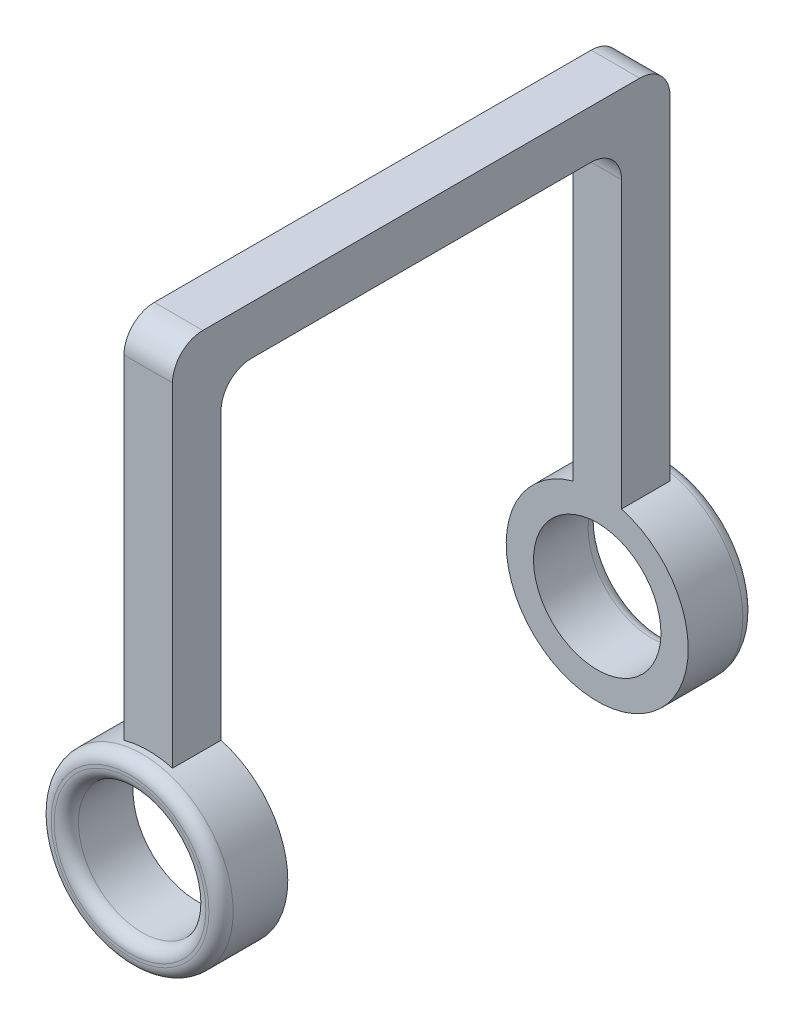
ISO-10303-21;
HEADER;
FILE_DESCRIPTION(('STEP AP214'),'2;1');
FILE_NAME('part.step','',(''),(''),'','','');
FILE_SCHEMA(('AUTOMOTIVE_DESIGN { 1 0 10303 214 1 1 1 1 }'));
ENDSEC;
DATA;
#1=APPLICATION_CONTEXT('core data for automotive mechanical design processes');
#2=APPLICATION_PROTOCOL_DEFINITION('international standard','automotive_design',2000,#1);
#3=PRODUCT_CONTEXT('',#1,'mechanical');
#4=PRODUCT('Part','Part','',(#3));
#5=PRODUCT_RELATED_PRODUCT_CATEGORY('part','',(#4));
#6=PRODUCT_DEFINITION_FORMATION('','',#4);
#7=PRODUCT_DEFINITION_CONTEXT('part definition',#1,'design');
#8=PRODUCT_DEFINITION('design','',#6,#7);
#9=PRODUCT_DEFINITION_SHAPE('','',#8);
#10=(LENGTH_UNIT() NAMED_UNIT(*) SI_UNIT(.MILLI.,.METRE.));
#11=(NAMED_UNIT(*) PLANE_ANGLE_UNIT() SI_UNIT($,.RADIAN.));
#12=(NAMED_UNIT(*) SI_UNIT($,.STERADIAN.) SOLID_ANGLE_UNIT());
#13=UNCERTAINTY_MEASURE_WITH_UNIT(LENGTH_MEASURE(1.E-05),#10,'distance_accuracy_value','');
#14=(GEOMETRIC_REPRESENTATION_CONTEXT(3) GLOBAL_UNCERTAINTY_ASSIGNED_CONTEXT((#13)) GLOBAL_UNIT_ASSIGNED_CONTEXT((#10,
#11,#12)) REPRESENTATION_CONTEXT('',''));
#15=CARTESIAN_POINT('',(0.,0.,0.));
#16=DIRECTION('',(0.,0.,1.));
#17=DIRECTION('',(1.,0.,0.));
#18=AXIS2_PLACEMENT_3D('',#15,#16,#17);
#19=CARTESIAN_POINT('',(0.,0.,-82.));
#20=DIRECTION('',(0.,0.,1.));
#21=DIRECTION('',(1.,0.,0.));
#22=AXIS2_PLACEMENT_3D('',#19,#20,#21);
#23=CYLINDRICAL_SURFACE('',#22,15.);
#24=CARTESIAN_POINT('',(0.,0.,1.));
#25=DIRECTION('',(0.,0.,1.));
#26=DIRECTION('',(1.,0.,0.));
#27=AXIS2_PLACEMENT_3D('',#24,#25,#26);
#28=CIRCLE('',#27,15.);
#29=CARTESIAN_POINT('',(15.,0.,1.));
#30=VERTEX_POINT('',#29);
#31=EDGE_CURVE('E240',#30,#30,#28,.F.);
#32=ORIENTED_EDGE('',*,*,#31,.T.);
#33=EDGE_LOOP('',(#32));
#34=FACE_BOUND('',#33,.T.);
#35=CARTESIAN_POINT('',(0.,0.,-8.00000000000001));
#36=DIRECTION('',(0.,0.,1.));
#37=DIRECTION('',(1.,0.,0.));
#38=AXIS2_PLACEMENT_3D('',#35,#36,#37);
#39=CIRCLE('',#38,15.);
#40=CARTESIAN_POINT('',(4.00000000000001,14.456832294801,-8.00000000000001));
#41=VERTEX_POINT('',#40);
#42=CARTESIAN_POINT('',(-4.,14.456832294801,-8.00000000000001));
#43=VERTEX_POINT('',#42);
#44=EDGE_CURVE('E291',#41,#43,#39,.F.);
#45=ORIENTED_EDGE('',*,*,#44,.F.);
#46=DIRECTION('',(0.,0.,1.));
#47=VECTOR('',#46,1.);
#48=CARTESIAN_POINT('',(4.00000000000001,14.456832294801,-82.));
#49=LINE('',#48,#47);
#50=CARTESIAN_POINT('',(4.00000000000001,14.456832294801,0.));
#51=VERTEX_POINT('',#50);
#52=EDGE_CURVE('E169',#41,#51,#49,.T.);
#53=ORIENTED_EDGE('',*,*,#52,.T.);
#54=CARTESIAN_POINT('',(0.,0.,0.));
#55=DIRECTION('',(0.,0.,1.));
#56=DIRECTION('',(1.,0.,0.));
#57=AXIS2_PLACEMENT_3D('',#54,#55,#56);
#58=CIRCLE('',#57,15.);
#59=CARTESIAN_POINT('',(-3.99999999999999,14.456832294801,0.));
#60=VERTEX_POINT('',#59);
#61=EDGE_CURVE('E308',#51,#60,#58,.T.);
#62=ORIENTED_EDGE('',*,*,#61,.T.);
#63=DIRECTION('',(0.,0.,1.));
#64=VECTOR('',#63,1.);
#65=CARTESIAN_POINT('',(-3.99999999999999,14.456832294801,-82.));
#66=LINE('',#65,#64);
#67=EDGE_CURVE('E295',#43,#60,#66,.T.);
#68=ORIENTED_EDGE('',*,*,#67,.F.);
#69=EDGE_LOOP('',(#45,#53,#62,#68));
#70=FACE_BOUND('',#69,.T.);
#71=ADVANCED_FACE('F41',(#34,#70),#23,.T.);
#72=CARTESIAN_POINT('',(0.,0.,-82.));
#73=DIRECTION('',(0.,0.,1.));
#74=DIRECTION('',(1.,0.,0.));
#75=AXIS2_PLACEMENT_3D('',#72,#73,#74);
#76=CYLINDRICAL_SURFACE('',#75,10.5);
#77=CARTESIAN_POINT('',(0.,0.,1.));
#78=DIRECTION('',(0.,0.,1.));
#79=DIRECTION('',(1.,0.,0.));
#80=AXIS2_PLACEMENT_3D('',#77,#78,#79);
#81=CIRCLE('',#80,10.5);
#82=CARTESIAN_POINT('',(10.5,0.,1.));
#83=VERTEX_POINT('',#82);
#84=EDGE_CURVE('E244',#83,#83,#81,.T.);
#85=ORIENTED_EDGE('',*,*,#84,.T.);
#86=EDGE_LOOP('',(#85));
#87=FACE_BOUND('',#86,.T.);
#88=CARTESIAN_POINT('',(0.,0.,-8.00000000000001));
#89=DIRECTION('',(0.,0.,1.));
#90=DIRECTION('',(1.,0.,0.));
#91=AXIS2_PLACEMENT_3D('',#88,#89,#90);
#92=CIRCLE('',#91,10.5);
#93=CARTESIAN_POINT('',(10.5,0.,-8.00000000000001));
#94=VERTEX_POINT('',#93);
#95=EDGE_CURVE('E314',#94,#94,#92,.F.);
#96=ORIENTED_EDGE('',*,*,#95,.T.);
#97=EDGE_LOOP('',(#96));
#98=FACE_BOUND('',#97,.T.);
#99=ADVANCED_FACE('F270',(#87,#98),#76,.F.);
#100=CARTESIAN_POINT('',(0.,0.,-83.));
#101=DIRECTION('',(0.,0.,-1.));
#102=DIRECTION('',(-1.,0.,0.));
#103=AXIS2_PLACEMENT_3D('',#100,#101,#102);
#104=CIRCLE('',#103,15.);
#105=CARTESIAN_POINT('',(-15.,0.,-83.));
#106=VERTEX_POINT('',#105);
#107=EDGE_CURVE('E248',#106,#106,#104,.F.);
#108=ORIENTED_EDGE('',*,*,#107,.T.);
#109=EDGE_LOOP('',(#108));
#110=FACE_BOUND('',#109,.T.);
#111=CARTESIAN_POINT('',(0.,0.,-74.));
#112=DIRECTION('',(0.,0.,-1.));
#113=DIRECTION('',(0.,1.,0.));
#114=AXIS2_PLACEMENT_3D('',#111,#112,#113);
#115=CIRCLE('',#114,15.);
#116=CARTESIAN_POINT('',(-4.,14.456832294801,-74.));
#117=VERTEX_POINT('',#116);
#118=CARTESIAN_POINT('',(4.00000000000001,14.456832294801,-74.));
#119=VERTEX_POINT('',#118);
#120=EDGE_CURVE('E135',#117,#119,#115,.F.);
#121=ORIENTED_EDGE('',*,*,#120,.F.);
#122=CARTESIAN_POINT('',(-4.,14.456832294801,-82.));
#123=VERTEX_POINT('',#122);
#124=EDGE_CURVE('E180',#123,#117,#66,.T.);
#125=ORIENTED_EDGE('',*,*,#124,.F.);
#126=CARTESIAN_POINT('',(0.,0.,-82.));
#127=DIRECTION('',(0.,0.,1.));
#128=DIRECTION('',(1.,0.,0.));
#129=AXIS2_PLACEMENT_3D('',#126,#127,#128);
#130=CIRCLE('',#129,15.);
#131=CARTESIAN_POINT('',(4.00000000000001,14.456832294801,-82.));
#132=VERTEX_POINT('',#131);
#133=EDGE_CURVE('E166',#132,#123,#130,.T.);
#134=ORIENTED_EDGE('',*,*,#133,.F.);
#135=EDGE_CURVE('E156',#132,#119,#49,.T.);
#136=ORIENTED_EDGE('',*,*,#135,.T.);
#137=EDGE_LOOP('',(#121,#125,#134,#136));
#138=FACE_BOUND('',#137,.T.);
#139=ADVANCED_FACE('F165',(#110,#138),#23,.T.);
#140=CARTESIAN_POINT('',(-3.99999999999999,0.,-82.));
#141=DIRECTION('',(1.,0.,0.));
#142=DIRECTION('',(0.,1.,0.));
#143=AXIS2_PLACEMENT_3D('',#140,#141,#142);
#144=PLANE('',#143);
#145=DIRECTION('',(0.,1.,0.));
#146=VECTOR('',#145,1.);
#147=CARTESIAN_POINT('',(-3.99999999999999,0.,0.));
#148=LINE('',#147,#146);
#149=CARTESIAN_POINT('',(-4.,69.456832294801,0.));
#150=VERTEX_POINT('',#149);
#151=EDGE_CURVE('E307',#60,#150,#148,.T.);
#152=ORIENTED_EDGE('',*,*,#151,.T.);
#153=CARTESIAN_POINT('',(-4.,69.456832294801,-5.));
#154=DIRECTION('',(1.,0.,0.));
#155=DIRECTION('',(0.,1.,0.));
#156=AXIS2_PLACEMENT_3D('',#153,#154,#155);
#157=CIRCLE('',#156,5.);
#158=CARTESIAN_POINT('',(-4.,74.456832294801,-5.));
#159=VERTEX_POINT('',#158);
#160=EDGE_CURVE('E214',#150,#159,#157,.F.);
#161=ORIENTED_EDGE('',*,*,#160,.T.);
#162=DIRECTION('',(0.,0.,1.));
#163=VECTOR('',#162,1.);
#164=CARTESIAN_POINT('',(-4.,74.456832294801,-82.));
#165=LINE('',#164,#163);
#166=CARTESIAN_POINT('',(-4.,74.456832294801,-77.));
#167=VERTEX_POINT('',#166);
#168=EDGE_CURVE('E173',#167,#159,#165,.T.);
#169=ORIENTED_EDGE('',*,*,#168,.F.);
#170=CARTESIAN_POINT('',(-4.,69.456832294801,-77.));
#171=DIRECTION('',(1.,0.,0.));
#172=DIRECTION('',(0.,1.,0.));
#173=AXIS2_PLACEMENT_3D('',#170,#171,#172);
#174=CIRCLE('',#173,5.);
#175=CARTESIAN_POINT('',(-4.,69.456832294801,-82.));
#176=VERTEX_POINT('',#175);
#177=EDGE_CURVE('E57',#167,#176,#174,.F.);
#178=ORIENTED_EDGE('',*,*,#177,.T.);
#179=DIRECTION('',(0.,1.,0.));
#180=VECTOR('',#179,1.);
#181=CARTESIAN_POINT('',(-3.99999999999999,0.,-82.));
#182=LINE('',#181,#180);
#183=EDGE_CURVE('E175',#123,#176,#182,.T.);
#184=ORIENTED_EDGE('',*,*,#183,.F.);
#185=ORIENTED_EDGE('',*,*,#124,.T.);
#186=DIRECTION('',(0.,1.,0.));
#187=VECTOR('',#186,1.);
#188=CARTESIAN_POINT('',(-3.99999999999999,0.,-74.));
#189=LINE('',#188,#187);
#190=CARTESIAN_POINT('',(-4.,61.456832294801,-74.));
#191=VERTEX_POINT('',#190);
#192=EDGE_CURVE('E143',#117,#191,#189,.T.);
#193=ORIENTED_EDGE('',*,*,#192,.T.);
#194=CARTESIAN_POINT('',(-4.,61.456832294801,-69.));
#195=DIRECTION('',(1.,0.,0.));
#196=DIRECTION('',(0.,1.,0.));
#197=AXIS2_PLACEMENT_3D('',#194,#195,#196);
#198=CIRCLE('',#197,5.);
#199=CARTESIAN_POINT('',(-4.,66.456832294801,-69.));
#200=VERTEX_POINT('',#199);
#201=EDGE_CURVE('E221',#191,#200,#198,.T.);
#202=ORIENTED_EDGE('',*,*,#201,.T.);
#203=DIRECTION('',(0.,0.,1.));
#204=VECTOR('',#203,1.);
#205=CARTESIAN_POINT('',(-4.,66.456832294801,-82.));
#206=LINE('',#205,#204);
#207=CARTESIAN_POINT('',(-4.,66.456832294801,-13.));
#208=VERTEX_POINT('',#207);
#209=EDGE_CURVE('E149',#200,#208,#206,.T.);
#210=ORIENTED_EDGE('',*,*,#209,.T.);
#211=CARTESIAN_POINT('',(-4.,61.456832294801,-13.));
#212=DIRECTION('',(1.,0.,0.));
#213=DIRECTION('',(0.,1.,0.));
#214=AXIS2_PLACEMENT_3D('',#211,#212,#213);
#215=CIRCLE('',#214,5.);
#216=CARTESIAN_POINT('',(-4.,61.456832294801,-8.00000000000001));
#217=VERTEX_POINT('',#216);
#218=EDGE_CURVE('E226',#208,#217,#215,.T.);
#219=ORIENTED_EDGE('',*,*,#218,.T.);
#220=DIRECTION('',(0.,-1.,0.));
#221=VECTOR('',#220,1.);
#222=CARTESIAN_POINT('',(-3.99999999999999,0.,-8.00000000000001));
#223=LINE('',#222,#221);
#224=EDGE_CURVE('E299',#217,#43,#223,.T.);
#225=ORIENTED_EDGE('',*,*,#224,.T.);
#226=ORIENTED_EDGE('',*,*,#67,.T.);
#227=EDGE_LOOP('',(#152,#161,#169,#178,#184,#185,#193,#202,#210,#219,#225,#226));
#228=FACE_BOUND('',#227,.T.);
#229=ADVANCED_FACE('F269',(#228),#144,.F.);
#230=CARTESIAN_POINT('',(0.,74.456832294801,-82.));
#231=DIRECTION('',(0.,-1.,0.));
#232=DIRECTION('',(0.,0.,-1.));
#233=AXIS2_PLACEMENT_3D('',#230,#231,#232);
#234=PLANE('',#233);
#235=ORIENTED_EDGE('',*,*,#168,.T.);
#236=DIRECTION('',(1.,0.,0.));
#237=VECTOR('',#236,1.);
#238=CARTESIAN_POINT('',(4.,74.456832294801,-5.));
#239=LINE('',#238,#237);
#240=CARTESIAN_POINT('',(4.,74.456832294801,-5.));
#241=VERTEX_POINT('',#240);
#242=EDGE_CURVE('E200',#159,#241,#239,.T.);
#243=ORIENTED_EDGE('',*,*,#242,.T.);
#244=DIRECTION('',(0.,0.,1.));
#245=VECTOR('',#244,1.);
#246=CARTESIAN_POINT('',(4.,74.456832294801,-82.));
#247=LINE('',#246,#245);
#248=CARTESIAN_POINT('',(4.,74.456832294801,-77.));
#249=VERTEX_POINT('',#248);
#250=EDGE_CURVE('E168',#249,#241,#247,.T.);
#251=ORIENTED_EDGE('',*,*,#250,.F.);
#252=DIRECTION('',(1.,0.,0.));
#253=VECTOR('',#252,1.);
#254=CARTESIAN_POINT('',(0.,74.456832294801,-77.));
#255=LINE('',#254,#253);
#256=EDGE_CURVE('E197',#249,#167,#255,.F.);
#257=ORIENTED_EDGE('',*,*,#256,.T.);
#258=EDGE_LOOP('',(#235,#243,#251,#257));
#259=FACE_BOUND('',#258,.T.);
#260=ADVANCED_FACE('F276',(#259),#234,.F.);
#261=CARTESIAN_POINT('',(0.,0.,-83.));
#262=DIRECTION('',(0.,0.,-1.));
#263=DIRECTION('',(-1.,0.,0.));
#264=AXIS2_PLACEMENT_3D('',#261,#262,#263);
#265=CIRCLE('',#264,10.5);
#266=CARTESIAN_POINT('',(-10.5,0.,-83.));
#267=VERTEX_POINT('',#266);
#268=EDGE_CURVE('E11',#267,#267,#265,.T.);
#269=ORIENTED_EDGE('',*,*,#268,.T.);
#270=EDGE_LOOP('',(#269));
#271=FACE_BOUND('',#270,.T.);
#272=CARTESIAN_POINT('',(0.,0.,-74.));
#273=DIRECTION('',(0.,0.,-1.));
#274=DIRECTION('',(0.,1.,0.));
#275=AXIS2_PLACEMENT_3D('',#272,#273,#274);
#276=CIRCLE('',#275,10.5);
#277=CARTESIAN_POINT('',(0.,10.5,-74.));
#278=VERTEX_POINT('',#277);
#279=EDGE_CURVE('E300',#278,#278,#276,.F.);
#280=ORIENTED_EDGE('',*,*,#279,.T.);
#281=EDGE_LOOP('',(#280));
#282=FACE_BOUND('',#281,.T.);
#283=ADVANCED_FACE('F280',(#271,#282),#76,.F.);
#284=CARTESIAN_POINT('',(4.00000000000001,0.,-82.));
#285=DIRECTION('',(1.,0.,0.));
#286=DIRECTION('',(0.,1.,0.));
#287=AXIS2_PLACEMENT_3D('',#284,#285,#286);
#288=PLANE('',#287);
#289=ORIENTED_EDGE('',*,*,#250,.T.);
#290=CARTESIAN_POINT('',(4.,69.456832294801,-5.));
#291=DIRECTION('',(1.,0.,0.));
#292=DIRECTION('',(0.,1.,0.));
#293=AXIS2_PLACEMENT_3D('',#290,#291,#292);
#294=CIRCLE('',#293,5.);
#295=CARTESIAN_POINT('',(4.,69.456832294801,0.));
#296=VERTEX_POINT('',#295);
#297=EDGE_CURVE('E207',#241,#296,#294,.T.);
#298=ORIENTED_EDGE('',*,*,#297,.T.);
#299=DIRECTION('',(0.,1.,0.));
#300=VECTOR('',#299,1.);
#301=CARTESIAN_POINT('',(4.00000000000001,0.,0.));
#302=LINE('',#301,#300);
#303=EDGE_CURVE('E304',#51,#296,#302,.T.);
#304=ORIENTED_EDGE('',*,*,#303,.F.);
#305=ORIENTED_EDGE('',*,*,#52,.F.);
#306=DIRECTION('',(0.,-1.,0.));
#307=VECTOR('',#306,1.);
#308=CARTESIAN_POINT('',(4.00000000000001,0.,-8.00000000000001));
#309=LINE('',#308,#307);
#310=CARTESIAN_POINT('',(4.,61.456832294801,-8.00000000000001));
#311=VERTEX_POINT('',#310);
#312=EDGE_CURVE('E162',#311,#41,#309,.T.);
#313=ORIENTED_EDGE('',*,*,#312,.F.);
#314=CARTESIAN_POINT('',(4.,61.456832294801,-13.));
#315=DIRECTION('',(1.,0.,0.));
#316=DIRECTION('',(0.,1.,0.));
#317=AXIS2_PLACEMENT_3D('',#314,#315,#316);
#318=CIRCLE('',#317,5.);
#319=CARTESIAN_POINT('',(4.,66.456832294801,-13.));
#320=VERTEX_POINT('',#319);
#321=EDGE_CURVE('E229',#311,#320,#318,.F.);
#322=ORIENTED_EDGE('',*,*,#321,.T.);
#323=DIRECTION('',(0.,0.,1.));
#324=VECTOR('',#323,1.);
#325=CARTESIAN_POINT('',(4.,66.456832294801,-82.));
#326=LINE('',#325,#324);
#327=CARTESIAN_POINT('',(4.,66.456832294801,-69.));
#328=VERTEX_POINT('',#327);
#329=EDGE_CURVE('E163',#328,#320,#326,.T.);
#330=ORIENTED_EDGE('',*,*,#329,.F.);
#331=CARTESIAN_POINT('',(4.,61.456832294801,-69.));
#332=DIRECTION('',(1.,0.,0.));
#333=DIRECTION('',(0.,1.,0.));
#334=AXIS2_PLACEMENT_3D('',#331,#332,#333);
#335=CIRCLE('',#334,5.);
#336=CARTESIAN_POINT('',(4.,61.456832294801,-74.));
#337=VERTEX_POINT('',#336);
#338=EDGE_CURVE('E160',#328,#337,#335,.F.);
#339=ORIENTED_EDGE('',*,*,#338,.T.);
#340=DIRECTION('',(0.,1.,0.));
#341=VECTOR('',#340,1.);
#342=CARTESIAN_POINT('',(4.00000000000001,0.,-74.));
#343=LINE('',#342,#341);
#344=EDGE_CURVE('E140',#119,#337,#343,.T.);
#345=ORIENTED_EDGE('',*,*,#344,.F.);
#346=ORIENTED_EDGE('',*,*,#135,.F.);
#347=DIRECTION('',(0.,1.,0.));
#348=VECTOR('',#347,1.);
#349=CARTESIAN_POINT('',(4.00000000000001,0.,-82.));
#350=LINE('',#349,#348);
#351=CARTESIAN_POINT('',(4.,69.456832294801,-82.));
#352=VERTEX_POINT('',#351);
#353=EDGE_CURVE('E318',#132,#352,#350,.T.);
#354=ORIENTED_EDGE('',*,*,#353,.T.);
#355=CARTESIAN_POINT('',(4.,69.456832294801,-77.));
#356=DIRECTION('',(1.,0.,0.));
#357=DIRECTION('',(0.,1.,0.));
#358=AXIS2_PLACEMENT_3D('',#355,#356,#357);
#359=CIRCLE('',#358,5.);
#360=EDGE_CURVE('E204',#352,#249,#359,.T.);
#361=ORIENTED_EDGE('',*,*,#360,.T.);
#362=EDGE_LOOP('',(#289,#298,#304,#305,#313,#322,#330,#339,#345,#346,#354,#361));
#363=FACE_BOUND('',#362,.T.);
#364=ADVANCED_FACE('F154',(#363),#288,.T.);
#365=CARTESIAN_POINT('',(0.,0.,-82.));
#366=DIRECTION('',(0.,0.,1.));
#367=DIRECTION('',(1.,0.,0.));
#368=AXIS2_PLACEMENT_3D('',#365,#366,#367);
#369=PLANE('',#368);
#370=ORIENTED_EDGE('',*,*,#183,.T.);
#371=DIRECTION('',(1.,0.,0.));
#372=VECTOR('',#371,1.);
#373=CARTESIAN_POINT('',(0.,69.456832294801,-82.));
#374=LINE('',#373,#372);
#375=EDGE_CURVE('E217',#176,#352,#374,.T.);
#376=ORIENTED_EDGE('',*,*,#375,.T.);
#377=ORIENTED_EDGE('',*,*,#353,.F.);
#378=ORIENTED_EDGE('',*,*,#133,.T.);
#379=EDGE_LOOP('',(#370,#376,#377,#378));
#380=FACE_BOUND('',#379,.T.);
#381=ADVANCED_FACE('F354',(#380),#369,.F.);
#382=CARTESIAN_POINT('',(0.,0.,0.));
#383=DIRECTION('',(0.,0.,1.));
#384=DIRECTION('',(1.,0.,0.));
#385=AXIS2_PLACEMENT_3D('',#382,#383,#384);
#386=PLANE('',#385);
#387=ORIENTED_EDGE('',*,*,#303,.T.);
#388=DIRECTION('',(1.,0.,0.));
#389=VECTOR('',#388,1.);
#390=CARTESIAN_POINT('',(-4.,69.456832294801,0.));
#391=LINE('',#390,#389);
#392=EDGE_CURVE('E65',#296,#150,#391,.F.);
#393=ORIENTED_EDGE('',*,*,#392,.T.);
#394=ORIENTED_EDGE('',*,*,#151,.F.);
#395=ORIENTED_EDGE('',*,*,#61,.F.);
#396=EDGE_LOOP('',(#387,#393,#394,#395));
#397=FACE_BOUND('',#396,.T.);
#398=ADVANCED_FACE('F310',(#397),#386,.T.);
#399=CARTESIAN_POINT('',(0.,0.,3.));
#400=DIRECTION('',(0.,0.,1.));
#401=DIRECTION('',(1.,0.,0.));
#402=AXIS2_PLACEMENT_3D('',#399,#400,#401);
#403=PLANE('',#402);
#404=CARTESIAN_POINT('',(0.,0.,3.));
#405=DIRECTION('',(0.,0.,1.));
#406=DIRECTION('',(1.,0.,0.));
#407=AXIS2_PLACEMENT_3D('',#404,#405,#406);
#408=CIRCLE('',#407,13.);
#409=CARTESIAN_POINT('',(13.,0.,3.));
#410=VERTEX_POINT('',#409);
#411=EDGE_CURVE('E236',#410,#410,#408,.T.);
#412=ORIENTED_EDGE('',*,*,#411,.T.);
#413=EDGE_LOOP('',(#412));
#414=FACE_BOUND('',#413,.T.);
#415=CARTESIAN_POINT('',(0.,0.,3.));
#416=DIRECTION('',(0.,0.,1.));
#417=DIRECTION('',(1.,0.,0.));
#418=AXIS2_PLACEMENT_3D('',#415,#416,#417);
#419=CIRCLE('',#418,12.5);
#420=CARTESIAN_POINT('',(12.5,0.,3.));
#421=VERTEX_POINT('',#420);
#422=EDGE_CURVE('E232',#421,#421,#419,.F.);
#423=ORIENTED_EDGE('',*,*,#422,.T.);
#424=EDGE_LOOP('',(#423));
#425=FACE_BOUND('',#424,.T.);
#426=ADVANCED_FACE('F395',(#414,#425),#403,.T.);
#427=CARTESIAN_POINT('',(0.,0.,-85.));
#428=DIRECTION('',(0.,0.,-1.));
#429=DIRECTION('',(1.,0.,0.));
#430=AXIS2_PLACEMENT_3D('',#427,#428,#429);
#431=PLANE('',#430);
#432=CARTESIAN_POINT('',(0.,0.,-85.));
#433=DIRECTION('',(0.,0.,-1.));
#434=DIRECTION('',(-1.,0.,0.));
#435=AXIS2_PLACEMENT_3D('',#432,#433,#434);
#436=CIRCLE('',#435,13.);
#437=CARTESIAN_POINT('',(-13.,0.,-85.));
#438=VERTEX_POINT('',#437);
#439=EDGE_CURVE('E50',#438,#438,#436,.T.);
#440=ORIENTED_EDGE('',*,*,#439,.T.);
#441=EDGE_LOOP('',(#440));
#442=FACE_BOUND('',#441,.T.);
#443=CARTESIAN_POINT('',(0.,0.,-85.));
#444=DIRECTION('',(0.,0.,-1.));
#445=DIRECTION('',(-1.,0.,0.));
#446=AXIS2_PLACEMENT_3D('',#443,#444,#445);
#447=CIRCLE('',#446,12.5);
#448=CARTESIAN_POINT('',(-12.5,0.,-85.));
#449=VERTEX_POINT('',#448);
#450=EDGE_CURVE('E252',#449,#449,#447,.F.);
#451=ORIENTED_EDGE('',*,*,#450,.T.);
#452=EDGE_LOOP('',(#451));
#453=FACE_BOUND('',#452,.T.);
#454=ADVANCED_FACE('F259',(#442,#453),#431,.T.);
#455=CARTESIAN_POINT('',(15.,-26.7787843753883,-8.));
#456=DIRECTION('',(0.,0.,1.));
#457=DIRECTION('',(1.,0.,0.));
#458=AXIS2_PLACEMENT_3D('',#455,#456,#457);
#459=PLANE('',#458);
#460=ORIENTED_EDGE('',*,*,#224,.F.);
#461=DIRECTION('',(-1.,0.,0.));
#462=VECTOR('',#461,1.);
#463=CARTESIAN_POINT('',(4.,61.456832294801,-8.));
#464=LINE('',#463,#462);
#465=EDGE_CURVE('E194',#217,#311,#464,.F.);
#466=ORIENTED_EDGE('',*,*,#465,.T.);
#467=ORIENTED_EDGE('',*,*,#312,.T.);
#468=ORIENTED_EDGE('',*,*,#44,.T.);
#469=EDGE_LOOP('',(#460,#466,#467,#468));
#470=FACE_BOUND('',#469,.T.);
#471=ORIENTED_EDGE('',*,*,#95,.F.);
#472=EDGE_LOOP('',(#471));
#473=FACE_BOUND('',#472,.T.);
#474=ADVANCED_FACE('F387',(#470,#473),#459,.F.);
#475=CARTESIAN_POINT('',(15.,-26.7787843753883,-74.));
#476=DIRECTION('',(0.,0.,-1.));
#477=DIRECTION('',(0.,1.,0.));
#478=AXIS2_PLACEMENT_3D('',#475,#476,#477);
#479=PLANE('',#478);
#480=ORIENTED_EDGE('',*,*,#344,.T.);
#481=DIRECTION('',(-1.,0.,0.));
#482=VECTOR('',#481,1.);
#483=CARTESIAN_POINT('',(-4.,61.456832294801,-74.));
#484=LINE('',#483,#482);
#485=EDGE_CURVE('E184',#337,#191,#484,.T.);
#486=ORIENTED_EDGE('',*,*,#485,.T.);
#487=ORIENTED_EDGE('',*,*,#192,.F.);
#488=ORIENTED_EDGE('',*,*,#120,.T.);
#489=EDGE_LOOP('',(#480,#486,#487,#488));
#490=FACE_BOUND('',#489,.T.);
#491=ORIENTED_EDGE('',*,*,#279,.F.);
#492=EDGE_LOOP('',(#491));
#493=FACE_BOUND('',#492,.T.);
#494=ADVANCED_FACE('F137',(#490,#493),#479,.F.);
#495=CARTESIAN_POINT('',(15.,66.456832294801,-74.));
#496=DIRECTION('',(0.,1.,0.));
#497=DIRECTION('',(-1.,0.,0.));
#498=AXIS2_PLACEMENT_3D('',#495,#496,#497);
#499=PLANE('',#498);
#500=ORIENTED_EDGE('',*,*,#209,.F.);
#501=DIRECTION('',(-1.,0.,0.));
#502=VECTOR('',#501,1.);
#503=CARTESIAN_POINT('',(4.,66.456832294801,-69.));
#504=LINE('',#503,#502);
#505=EDGE_CURVE('E191',#200,#328,#504,.F.);
#506=ORIENTED_EDGE('',*,*,#505,.T.);
#507=ORIENTED_EDGE('',*,*,#329,.T.);
#508=DIRECTION('',(-1.,0.,0.));
#509=VECTOR('',#508,1.);
#510=CARTESIAN_POINT('',(-4.,66.456832294801,-13.));
#511=LINE('',#510,#509);
#512=EDGE_CURVE('E187',#320,#208,#511,.T.);
#513=ORIENTED_EDGE('',*,*,#512,.T.);
#514=EDGE_LOOP('',(#500,#506,#507,#513));
#515=FACE_BOUND('',#514,.T.);
#516=ADVANCED_FACE('F348',(#515),#499,.F.);
#517=CARTESIAN_POINT('',(15.,61.456832294801,-69.));
#518=DIRECTION('',(1.,0.,0.));
#519=DIRECTION('',(0.,1.,0.));
#520=AXIS2_PLACEMENT_3D('',#517,#518,#519);
#521=CYLINDRICAL_SURFACE('',#520,5.);
#522=ORIENTED_EDGE('',*,*,#338,.F.);
#523=ORIENTED_EDGE('',*,*,#505,.F.);
#524=ORIENTED_EDGE('',*,*,#201,.F.);
#525=ORIENTED_EDGE('',*,*,#485,.F.);
#526=EDGE_LOOP('',(#522,#523,#524,#525));
#527=FACE_BOUND('',#526,.T.);
#528=ADVANCED_FACE('F351',(#527),#521,.F.);
#529=CARTESIAN_POINT('',(15.,61.456832294801,-13.));
#530=DIRECTION('',(1.,0.,0.));
#531=DIRECTION('',(0.,1.,0.));
#532=AXIS2_PLACEMENT_3D('',#529,#530,#531);
#533=CYLINDRICAL_SURFACE('',#532,5.);
#534=ORIENTED_EDGE('',*,*,#321,.F.);
#535=ORIENTED_EDGE('',*,*,#465,.F.);
#536=ORIENTED_EDGE('',*,*,#218,.F.);
#537=ORIENTED_EDGE('',*,*,#512,.F.);
#538=EDGE_LOOP('',(#534,#535,#536,#537));
#539=FACE_BOUND('',#538,.T.);
#540=ADVANCED_FACE('F362',(#539),#533,.F.);
#541=CARTESIAN_POINT('',(0.,69.456832294801,-5.));
#542=DIRECTION('',(-1.,0.,0.));
#543=DIRECTION('',(0.,0.,1.));
#544=AXIS2_PLACEMENT_3D('',#541,#542,#543);
#545=CYLINDRICAL_SURFACE('',#544,5.);
#546=ORIENTED_EDGE('',*,*,#160,.F.);
#547=ORIENTED_EDGE('',*,*,#392,.F.);
#548=ORIENTED_EDGE('',*,*,#297,.F.);
#549=ORIENTED_EDGE('',*,*,#242,.F.);
#550=EDGE_LOOP('',(#546,#547,#548,#549));
#551=FACE_BOUND('',#550,.T.);
#552=ADVANCED_FACE('F360',(#551),#545,.T.);
#553=CARTESIAN_POINT('',(0.,69.456832294801,-77.));
#554=DIRECTION('',(1.,0.,0.));
#555=DIRECTION('',(0.,0.,-1.));
#556=AXIS2_PLACEMENT_3D('',#553,#554,#555);
#557=CYLINDRICAL_SURFACE('',#556,5.);
#558=ORIENTED_EDGE('',*,*,#177,.F.);
#559=ORIENTED_EDGE('',*,*,#256,.F.);
#560=ORIENTED_EDGE('',*,*,#360,.F.);
#561=ORIENTED_EDGE('',*,*,#375,.F.);
#562=EDGE_LOOP('',(#558,#559,#560,#561));
#563=FACE_BOUND('',#562,.T.);
#564=ADVANCED_FACE('F356',(#563),#557,.T.);
#565=CARTESIAN_POINT('',(0.,0.,1.));
#566=DIRECTION('',(0.,0.,1.));
#567=DIRECTION('',(1.,0.,0.));
#568=AXIS2_PLACEMENT_3D('',#565,#566,#567);
#569=TOROIDAL_SURFACE('',#568,13.,2.);
#570=ORIENTED_EDGE('',*,*,#31,.F.);
#571=EDGE_LOOP('',(#570));
#572=FACE_BOUND('',#571,.T.);
#573=ORIENTED_EDGE('',*,*,#411,.F.);
#574=EDGE_LOOP('',(#573));
#575=FACE_BOUND('',#574,.T.);
#576=ADVANCED_FACE('F368',(#572,#575),#569,.T.);
#577=CARTESIAN_POINT('',(0.,0.,1.));
#578=DIRECTION('',(0.,0.,1.));
#579=DIRECTION('',(1.,0.,0.));
#580=AXIS2_PLACEMENT_3D('',#577,#578,#579);
#581=TOROIDAL_SURFACE('',#580,12.5,2.);
#582=ORIENTED_EDGE('',*,*,#422,.F.);
#583=EDGE_LOOP('',(#582));
#584=FACE_BOUND('',#583,.T.);
#585=ORIENTED_EDGE('',*,*,#84,.F.);
#586=EDGE_LOOP('',(#585));
#587=FACE_BOUND('',#586,.T.);
#588=ADVANCED_FACE('F265',(#584,#587),#581,.T.);
#589=CARTESIAN_POINT('',(0.,0.,-83.));
#590=DIRECTION('',(0.,0.,-1.));
#591=DIRECTION('',(-1.,0.,0.));
#592=AXIS2_PLACEMENT_3D('',#589,#590,#591);
#593=TOROIDAL_SURFACE('',#592,13.,2.);
#594=ORIENTED_EDGE('',*,*,#439,.F.);
#595=EDGE_LOOP('',(#594));
#596=FACE_BOUND('',#595,.T.);
#597=ORIENTED_EDGE('',*,*,#107,.F.);
#598=EDGE_LOOP('',(#597));
#599=FACE_BOUND('',#598,.T.);
#600=ADVANCED_FACE('F262',(#596,#599),#593,.T.);
#601=CARTESIAN_POINT('',(0.,0.,-83.));
#602=DIRECTION('',(0.,0.,-1.));
#603=DIRECTION('',(-1.,0.,0.));
#604=AXIS2_PLACEMENT_3D('',#601,#602,#603);
#605=TOROIDAL_SURFACE('',#604,12.5,2.);
#606=ORIENTED_EDGE('',*,*,#268,.F.);
#607=EDGE_LOOP('',(#606));
#608=FACE_BOUND('',#607,.T.);
#609=ORIENTED_EDGE('',*,*,#450,.F.);
#610=EDGE_LOOP('',(#609));
#611=FACE_BOUND('',#610,.T.);
#612=ADVANCED_FACE('F43',(#608,#611),#605,.T.);
#613=CLOSED_SHELL('',(#71,#99,#139,#229,#260,#283,#364,#381,#398,#426,#454,#474,#494,#516,#528,
#540,#552,#564,#576,#588,#600,#612));
#614=MANIFOLD_SOLID_BREP('B2',#613);
#615=ADVANCED_BREP_SHAPE_REPRESENTATION('',(#18,#614),#14);
#616=SHAPE_DEFINITION_REPRESENTATION(#9,#615);
ENDSEC;
END-ISO-10303-21;
